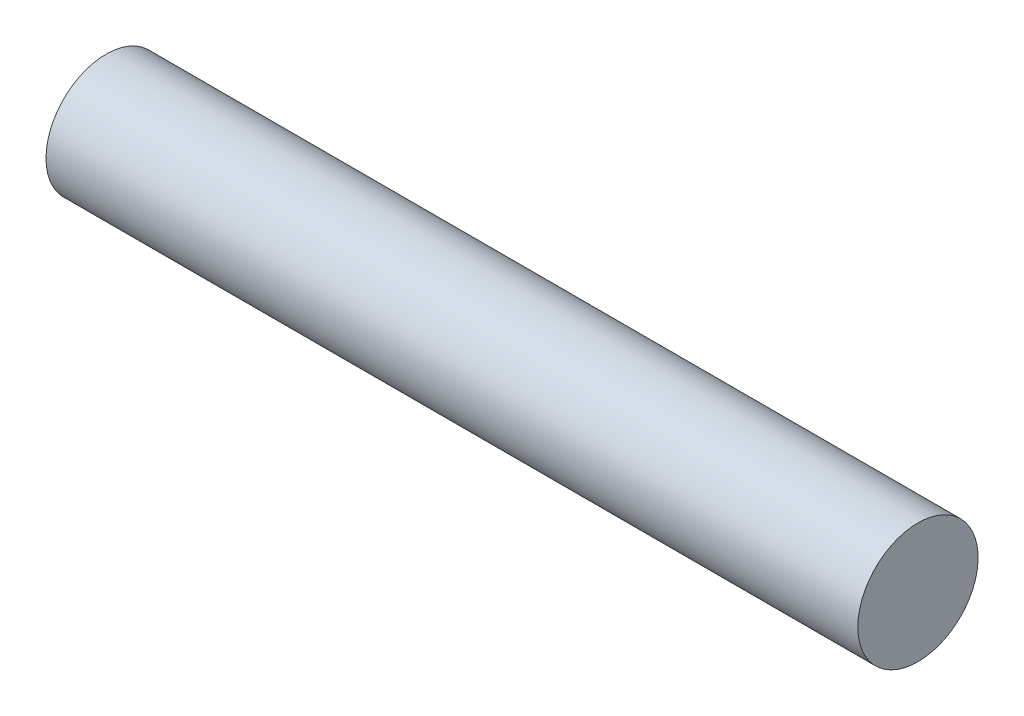
ISO-10303-21;
HEADER;
FILE_DESCRIPTION(('STEP AP214'),'2;1');
FILE_NAME('part.step','',(''),(''),'','','');
FILE_SCHEMA(('AUTOMOTIVE_DESIGN { 1 0 10303 214 1 1 1 1 }'));
ENDSEC;
DATA;
#1=APPLICATION_CONTEXT('core data for automotive mechanical design processes');
#2=APPLICATION_PROTOCOL_DEFINITION('international standard','automotive_design',2000,#1);
#3=PRODUCT_CONTEXT('',#1,'mechanical');
#4=PRODUCT('Part','Part','',(#3));
#5=PRODUCT_RELATED_PRODUCT_CATEGORY('part','',(#4));
#6=PRODUCT_DEFINITION_FORMATION('','',#4);
#7=PRODUCT_DEFINITION_CONTEXT('part definition',#1,'design');
#8=PRODUCT_DEFINITION('design','',#6,#7);
#9=PRODUCT_DEFINITION_SHAPE('','',#8);
#10=(LENGTH_UNIT() NAMED_UNIT(*) SI_UNIT(.MILLI.,.METRE.));
#11=(NAMED_UNIT(*) PLANE_ANGLE_UNIT() SI_UNIT($,.RADIAN.));
#12=(NAMED_UNIT(*) SI_UNIT($,.STERADIAN.) SOLID_ANGLE_UNIT());
#13=UNCERTAINTY_MEASURE_WITH_UNIT(LENGTH_MEASURE(1.E-05),#10,'distance_accuracy_value','');
#14=(GEOMETRIC_REPRESENTATION_CONTEXT(3) GLOBAL_UNCERTAINTY_ASSIGNED_CONTEXT((#13)) GLOBAL_UNIT_ASSIGNED_CONTEXT((#10,
#11,#12)) REPRESENTATION_CONTEXT('',''));
#15=CARTESIAN_POINT('',(0.,0.,0.));
#16=DIRECTION('',(0.,0.,1.));
#17=DIRECTION('',(1.,0.,0.));
#18=AXIS2_PLACEMENT_3D('',#15,#16,#17);
#19=CARTESIAN_POINT('',(0.,0.,0.));
#20=DIRECTION('',(1.,0.,0.));
#21=DIRECTION('',(0.,0.,-1.));
#22=AXIS2_PLACEMENT_3D('',#19,#20,#21);
#23=PLANE('',#22);
#24=CARTESIAN_POINT('',(0.,0.,0.));
#25=DIRECTION('',(-1.,0.,0.));
#26=DIRECTION('',(0.,0.,1.));
#27=AXIS2_PLACEMENT_3D('',#24,#25,#26);
#28=CIRCLE('',#27,6.);
#29=CARTESIAN_POINT('',(0.,0.,6.));
#30=VERTEX_POINT('',#29);
#31=EDGE_CURVE('E10',#30,#30,#28,.T.);
#32=ORIENTED_EDGE('',*,*,#31,.T.);
#33=EDGE_LOOP('',(#32));
#34=FACE_BOUND('',#33,.T.);
#35=ADVANCED_FACE('F41',(#34),#23,.F.);
#36=CARTESIAN_POINT('',(0.,0.,0.));
#37=DIRECTION('',(-1.,0.,0.));
#38=DIRECTION('',(0.,0.,1.));
#39=AXIS2_PLACEMENT_3D('',#36,#37,#38);
#40=CYLINDRICAL_SURFACE('',#39,6.);
#41=ORIENTED_EDGE('',*,*,#31,.F.);
#42=EDGE_LOOP('',(#41));
#43=FACE_BOUND('',#42,.T.);
#44=CARTESIAN_POINT('',(81.,0.,0.));
#45=DIRECTION('',(-1.,0.,0.));
#46=DIRECTION('',(0.,0.,1.));
#47=AXIS2_PLACEMENT_3D('',#44,#45,#46);
#48=CIRCLE('',#47,6.);
#49=CARTESIAN_POINT('',(81.,0.,6.));
#50=VERTEX_POINT('',#49);
#51=EDGE_CURVE('E47',#50,#50,#48,.T.);
#52=ORIENTED_EDGE('',*,*,#51,.T.);
#53=EDGE_LOOP('',(#52));
#54=FACE_BOUND('',#53,.T.);
#55=ADVANCED_FACE('F53',(#43,#54),#40,.T.);
#56=CARTESIAN_POINT('',(81.,6.,0.));
#57=DIRECTION('',(-1.,0.,0.));
#58=DIRECTION('',(0.,0.,1.));
#59=AXIS2_PLACEMENT_3D('',#56,#57,#58);
#60=PLANE('',#59);
#61=ORIENTED_EDGE('',*,*,#51,.F.);
#62=EDGE_LOOP('',(#61));
#63=FACE_BOUND('',#62,.T.);
#64=ADVANCED_FACE('F55',(#63),#60,.F.);
#65=CLOSED_SHELL('',(#35,#55,#64));
#66=MANIFOLD_SOLID_BREP('B2',#65);
#67=ADVANCED_BREP_SHAPE_REPRESENTATION('',(#18,#66),#14);
#68=SHAPE_DEFINITION_REPRESENTATION(#9,#67);
ENDSEC;
END-ISO-10303-21;
